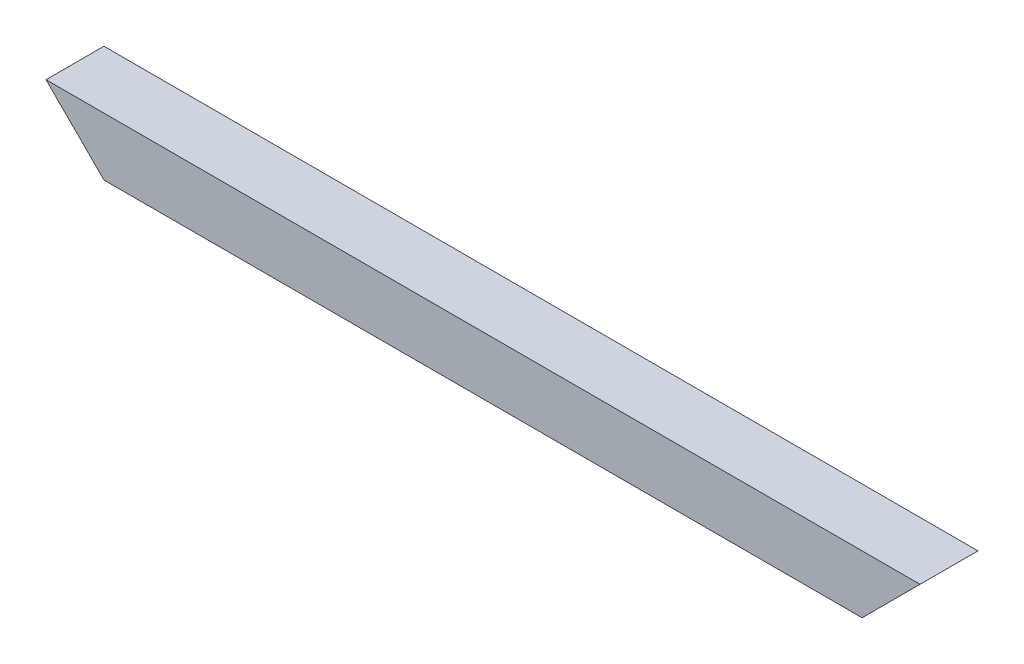
ISO-10303-21;
HEADER;
FILE_DESCRIPTION(('STEP AP214'),'2;1');
FILE_NAME('part.step','',(''),(''),'','','');
FILE_SCHEMA(('AUTOMOTIVE_DESIGN { 1 0 10303 214 1 1 1 1 }'));
ENDSEC;
DATA;
#1=APPLICATION_CONTEXT('core data for automotive mechanical design processes');
#2=APPLICATION_PROTOCOL_DEFINITION('international standard','automotive_design',2000,#1);
#3=PRODUCT_CONTEXT('',#1,'mechanical');
#4=PRODUCT('Part','Part','',(#3));
#5=PRODUCT_RELATED_PRODUCT_CATEGORY('part','',(#4));
#6=PRODUCT_DEFINITION_FORMATION('','',#4);
#7=PRODUCT_DEFINITION_CONTEXT('part definition',#1,'design');
#8=PRODUCT_DEFINITION('design','',#6,#7);
#9=PRODUCT_DEFINITION_SHAPE('','',#8);
#10=(LENGTH_UNIT() NAMED_UNIT(*) SI_UNIT(.MILLI.,.METRE.));
#11=(NAMED_UNIT(*) PLANE_ANGLE_UNIT() SI_UNIT($,.RADIAN.));
#12=(NAMED_UNIT(*) SI_UNIT($,.STERADIAN.) SOLID_ANGLE_UNIT());
#13=UNCERTAINTY_MEASURE_WITH_UNIT(LENGTH_MEASURE(1.E-05),#10,'distance_accuracy_value','');
#14=(GEOMETRIC_REPRESENTATION_CONTEXT(3) GLOBAL_UNCERTAINTY_ASSIGNED_CONTEXT((#13)) GLOBAL_UNIT_ASSIGNED_CONTEXT((#10,
#11,#12)) REPRESENTATION_CONTEXT('',''));
#15=CARTESIAN_POINT('',(0.,0.,0.));
#16=DIRECTION('',(0.,0.,1.));
#17=DIRECTION('',(1.,0.,0.));
#18=AXIS2_PLACEMENT_3D('',#15,#16,#17);
#19=CARTESIAN_POINT('',(574.7363918,-38.1,0.));
#20=DIRECTION('',(0.,1.,0.));
#21=DIRECTION('',(0.,0.,1.));
#22=AXIS2_PLACEMENT_3D('',#19,#20,#21);
#23=PLANE('',#22);
#24=DIRECTION('',(0.,0.,-1.));
#25=VECTOR('',#24,1.);
#26=CARTESIAN_POINT('',(536.6363918,-38.1,721.570704326769));
#27=LINE('',#26,#25);
#28=CARTESIAN_POINT('',(536.6363918,-38.1,0.));
#29=VERTEX_POINT('',#28);
#30=CARTESIAN_POINT('',(536.6363918,-38.1,-38.1));
#31=VERTEX_POINT('',#30);
#32=EDGE_CURVE('E59',#29,#31,#27,.T.);
#33=ORIENTED_EDGE('',*,*,#32,.F.);
#34=DIRECTION('',(-1.,0.,0.));
#35=VECTOR('',#34,1.);
#36=CARTESIAN_POINT('',(574.7363918,-38.1,0.));
#37=LINE('',#36,#35);
#38=CARTESIAN_POINT('',(38.1000000000002,-38.1,0.));
#39=VERTEX_POINT('',#38);
#40=EDGE_CURVE('E65',#29,#39,#37,.T.);
#41=ORIENTED_EDGE('',*,*,#40,.T.);
#42=DIRECTION('',(0.,0.,-1.));
#43=VECTOR('',#42,1.);
#44=CARTESIAN_POINT('',(38.1,-38.1,721.570704326769));
#45=LINE('',#44,#43);
#46=CARTESIAN_POINT('',(38.1,-38.1,-38.1));
#47=VERTEX_POINT('',#46);
#48=EDGE_CURVE('E99',#39,#47,#45,.T.);
#49=ORIENTED_EDGE('',*,*,#48,.T.);
#50=DIRECTION('',(-1.,0.,0.));
#51=VECTOR('',#50,1.);
#52=CARTESIAN_POINT('',(574.7363918,-38.1,-38.1));
#53=LINE('',#52,#51);
#54=EDGE_CURVE('E107',#31,#47,#53,.T.);
#55=ORIENTED_EDGE('',*,*,#54,.F.);
#56=EDGE_LOOP('',(#33,#41,#49,#55));
#57=FACE_BOUND('',#56,.T.);
#58=ADVANCED_FACE('F43',(#57),#23,.F.);
#59=CARTESIAN_POINT('',(574.7363918,0.,0.));
#60=DIRECTION('',(0.,0.,-1.));
#61=DIRECTION('',(0.,1.,0.));
#62=AXIS2_PLACEMENT_3D('',#59,#60,#61);
#63=PLANE('',#62);
#64=ORIENTED_EDGE('',*,*,#40,.F.);
#65=DIRECTION('',(0.707106781186548,0.707106781186547,0.));
#66=VECTOR('',#65,1.);
#67=CARTESIAN_POINT('',(574.7363918,0.,0.));
#68=LINE('',#67,#66);
#69=CARTESIAN_POINT('',(574.7363918,0.,0.));
#70=VERTEX_POINT('',#69);
#71=EDGE_CURVE('E86',#29,#70,#68,.T.);
#72=ORIENTED_EDGE('',*,*,#71,.T.);
#73=DIRECTION('',(-1.,0.,0.));
#74=VECTOR('',#73,1.);
#75=CARTESIAN_POINT('',(574.7363918,0.,0.));
#76=LINE('',#75,#74);
#77=CARTESIAN_POINT('',(0.,0.,0.));
#78=VERTEX_POINT('',#77);
#79=EDGE_CURVE('E92',#70,#78,#76,.T.);
#80=ORIENTED_EDGE('',*,*,#79,.T.);
#81=DIRECTION('',(-0.707106781186548,0.707106781186548,0.));
#82=VECTOR('',#81,1.);
#83=CARTESIAN_POINT('',(287.3681959,-287.3681959,0.));
#84=LINE('',#83,#82);
#85=EDGE_CURVE('E123',#39,#78,#84,.T.);
#86=ORIENTED_EDGE('',*,*,#85,.F.);
#87=EDGE_LOOP('',(#64,#72,#80,#86));
#88=FACE_BOUND('',#87,.T.);
#89=ADVANCED_FACE('F45',(#88),#63,.F.);
#90=CARTESIAN_POINT('',(574.7363918,0.,-38.1));
#91=DIRECTION('',(0.,0.,1.));
#92=DIRECTION('',(0.,-1.,0.));
#93=AXIS2_PLACEMENT_3D('',#90,#91,#92);
#94=PLANE('',#93);
#95=DIRECTION('',(-1.,0.,0.));
#96=VECTOR('',#95,1.);
#97=CARTESIAN_POINT('',(574.7363918,0.,-38.1));
#98=LINE('',#97,#96);
#99=CARTESIAN_POINT('',(574.7363918,0.,-38.1));
#100=VERTEX_POINT('',#99);
#101=CARTESIAN_POINT('',(0.,0.,-38.1));
#102=VERTEX_POINT('',#101);
#103=EDGE_CURVE('E104',#100,#102,#98,.T.);
#104=ORIENTED_EDGE('',*,*,#103,.F.);
#105=DIRECTION('',(-0.707106781186548,-0.707106781186547,0.));
#106=VECTOR('',#105,1.);
#107=CARTESIAN_POINT('',(574.7363918,0.,-38.1));
#108=LINE('',#107,#106);
#109=EDGE_CURVE('E11',#100,#31,#108,.T.);
#110=ORIENTED_EDGE('',*,*,#109,.T.);
#111=ORIENTED_EDGE('',*,*,#54,.T.);
#112=DIRECTION('',(0.707106781186548,-0.707106781186548,0.));
#113=VECTOR('',#112,1.);
#114=CARTESIAN_POINT('',(287.3681959,-287.3681959,-38.1000000000001));
#115=LINE('',#114,#113);
#116=EDGE_CURVE('E52',#102,#47,#115,.T.);
#117=ORIENTED_EDGE('',*,*,#116,.F.);
#118=EDGE_LOOP('',(#104,#110,#111,#117));
#119=FACE_BOUND('',#118,.T.);
#120=ADVANCED_FACE('F120',(#119),#94,.F.);
#121=CARTESIAN_POINT('',(574.7363918,0.,0.));
#122=DIRECTION('',(0.,-1.,0.));
#123=DIRECTION('',(0.,0.,-1.));
#124=AXIS2_PLACEMENT_3D('',#121,#122,#123);
#125=PLANE('',#124);
#126=DIRECTION('',(0.,0.,1.));
#127=VECTOR('',#126,1.);
#128=CARTESIAN_POINT('',(0.,0.,0.));
#129=LINE('',#128,#127);
#130=EDGE_CURVE('E93',#102,#78,#129,.T.);
#131=ORIENTED_EDGE('',*,*,#130,.T.);
#132=ORIENTED_EDGE('',*,*,#79,.F.);
#133=DIRECTION('',(0.,0.,1.));
#134=VECTOR('',#133,1.);
#135=CARTESIAN_POINT('',(574.7363918,0.,0.));
#136=LINE('',#135,#134);
#137=EDGE_CURVE('E83',#100,#70,#136,.T.);
#138=ORIENTED_EDGE('',*,*,#137,.F.);
#139=ORIENTED_EDGE('',*,*,#103,.T.);
#140=EDGE_LOOP('',(#131,#132,#138,#139));
#141=FACE_BOUND('',#140,.T.);
#142=ADVANCED_FACE('F101',(#141),#125,.F.);
#143=CARTESIAN_POINT('',(38.1,-38.1,721.570704326769));
#144=DIRECTION('',(-0.707106781186548,-0.707106781186548,0.));
#145=DIRECTION('',(0.707106781186548,-0.707106781186548,0.));
#146=AXIS2_PLACEMENT_3D('',#143,#144,#145);
#147=PLANE('',#146);
#148=ORIENTED_EDGE('',*,*,#48,.F.);
#149=ORIENTED_EDGE('',*,*,#85,.T.);
#150=ORIENTED_EDGE('',*,*,#130,.F.);
#151=ORIENTED_EDGE('',*,*,#116,.T.);
#152=EDGE_LOOP('',(#148,#149,#150,#151));
#153=FACE_BOUND('',#152,.T.);
#154=ADVANCED_FACE('F118',(#153),#147,.T.);
#155=CARTESIAN_POINT('',(536.6363918,-38.1,721.570704326769));
#156=DIRECTION('',(-0.707106781186547,0.707106781186548,0.));
#157=DIRECTION('',(-0.707106781186548,-0.707106781186547,0.));
#158=AXIS2_PLACEMENT_3D('',#155,#156,#157);
#159=PLANE('',#158);
#160=ORIENTED_EDGE('',*,*,#71,.F.);
#161=ORIENTED_EDGE('',*,*,#32,.T.);
#162=ORIENTED_EDGE('',*,*,#109,.F.);
#163=ORIENTED_EDGE('',*,*,#137,.T.);
#164=EDGE_LOOP('',(#160,#161,#162,#163));
#165=FACE_BOUND('',#164,.T.);
#166=ADVANCED_FACE('F85',(#165),#159,.F.);
#167=CLOSED_SHELL('',(#58,#89,#120,#142,#154,#166));
#168=MANIFOLD_SOLID_BREP('B2',#167);
#169=ADVANCED_BREP_SHAPE_REPRESENTATION('',(#18,#168),#14);
#170=SHAPE_DEFINITION_REPRESENTATION(#9,#169);
ENDSEC;
END-ISO-10303-21;
